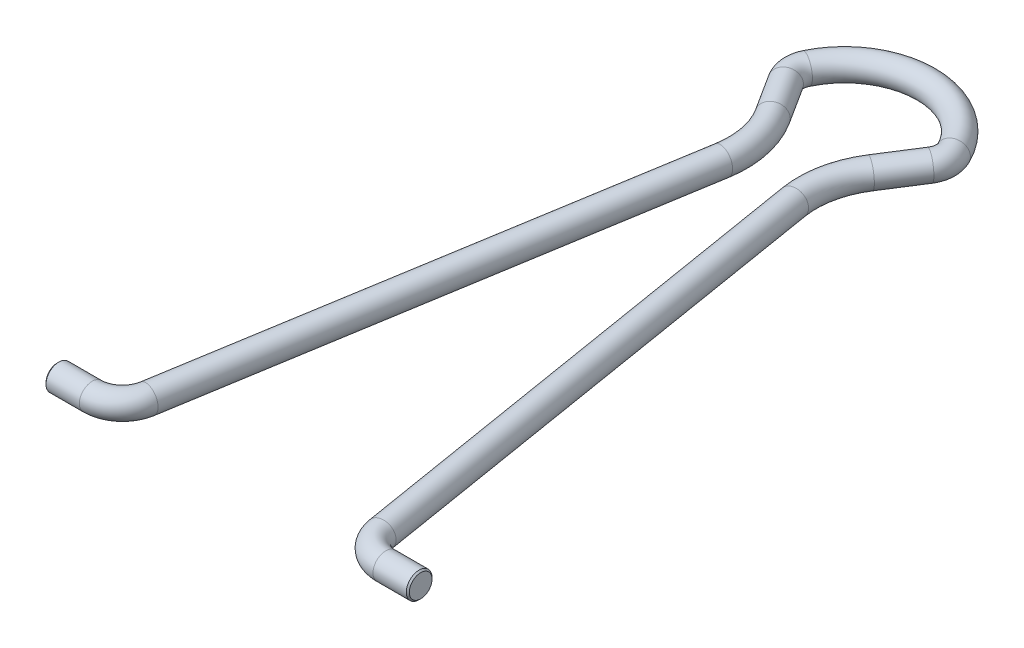
ISO-10303-21;
HEADER;
FILE_DESCRIPTION(('STEP AP214'),'2;1');
FILE_NAME('part.step','',(''),(''),'','','');
FILE_SCHEMA(('AUTOMOTIVE_DESIGN { 1 0 10303 214 1 1 1 1 }'));
ENDSEC;
DATA;
#1=APPLICATION_CONTEXT('core data for automotive mechanical design processes');
#2=APPLICATION_PROTOCOL_DEFINITION('international standard','automotive_design',2000,#1);
#3=PRODUCT_CONTEXT('',#1,'mechanical');
#4=PRODUCT('Part','Part','',(#3));
#5=PRODUCT_RELATED_PRODUCT_CATEGORY('part','',(#4));
#6=PRODUCT_DEFINITION_FORMATION('','',#4);
#7=PRODUCT_DEFINITION_CONTEXT('part definition',#1,'design');
#8=PRODUCT_DEFINITION('design','',#6,#7);
#9=PRODUCT_DEFINITION_SHAPE('','',#8);
#10=(LENGTH_UNIT() NAMED_UNIT(*) SI_UNIT(.MILLI.,.METRE.));
#11=(NAMED_UNIT(*) PLANE_ANGLE_UNIT() SI_UNIT($,.RADIAN.));
#12=(NAMED_UNIT(*) SI_UNIT($,.STERADIAN.) SOLID_ANGLE_UNIT());
#13=UNCERTAINTY_MEASURE_WITH_UNIT(LENGTH_MEASURE(1.E-05),#10,'distance_accuracy_value','');
#14=(GEOMETRIC_REPRESENTATION_CONTEXT(3) GLOBAL_UNCERTAINTY_ASSIGNED_CONTEXT((#13)) GLOBAL_UNIT_ASSIGNED_CONTEXT((#10,
#11,#12)) REPRESENTATION_CONTEXT('',''));
#15=CARTESIAN_POINT('',(0.,0.,0.));
#16=DIRECTION('',(0.,0.,1.));
#17=DIRECTION('',(1.,0.,0.));
#18=AXIS2_PLACEMENT_3D('',#15,#16,#17);
#19=CARTESIAN_POINT('',(9.6983875282643,0.,40.));
#20=DIRECTION('',(1.,0.,0.));
#21=DIRECTION('',(0.,0.,-1.));
#22=AXIS2_PLACEMENT_3D('',#19,#20,#21);
#23=CYLINDRICAL_SURFACE('',#22,0.85);
#24=CARTESIAN_POINT('',(11.9,0.,40.));
#25=DIRECTION('',(-1.,0.,0.));
#26=DIRECTION('',(0.,0.,1.));
#27=AXIS2_PLACEMENT_3D('',#24,#25,#26);
#28=CIRCLE('',#27,0.85);
#29=CARTESIAN_POINT('',(11.9,0.,40.85));
#30=VERTEX_POINT('',#29);
#31=EDGE_CURVE('E40',#30,#30,#28,.T.);
#32=ORIENTED_EDGE('',*,*,#31,.T.);
#33=EDGE_LOOP('',(#32));
#34=FACE_BOUND('',#33,.T.);
#35=CARTESIAN_POINT('',(9.6983875282643,0.,40.));
#36=DIRECTION('',(-1.,0.,0.));
#37=DIRECTION('',(0.,0.,1.));
#38=AXIS2_PLACEMENT_3D('',#35,#36,#37);
#39=CIRCLE('',#38,0.85);
#40=CARTESIAN_POINT('',(9.69838752826431,0.,40.85));
#41=VERTEX_POINT('',#40);
#42=EDGE_CURVE('E53',#41,#41,#39,.T.);
#43=ORIENTED_EDGE('',*,*,#42,.F.);
#44=EDGE_LOOP('',(#43));
#45=FACE_BOUND('',#44,.T.);
#46=ADVANCED_FACE('F33',(#34,#45),#23,.T.);
#47=CARTESIAN_POINT('',(9.6983875282643,0.,38.));
#48=DIRECTION('',(0.,1.,0.));
#49=DIRECTION('',(0.,0.,1.));
#50=AXIS2_PLACEMENT_3D('',#47,#48,#49);
#51=TOROIDAL_SURFACE('',#50,2.00000000000001,0.85);
#52=CARTESIAN_POINT('',(7.7248149569055,0.,38.3240544793399));
#53=DIRECTION('',(-0.162027239669911,0.,-0.986786285679401));
#54=DIRECTION('',(-0.986786285679401,0.,0.162027239669911));
#55=AXIS2_PLACEMENT_3D('',#52,#53,#54);
#56=CIRCLE('',#55,0.85);
#57=CARTESIAN_POINT('',(6.88604661407801,0.,38.4617776330593));
#58=VERTEX_POINT('',#57);
#59=EDGE_CURVE('E56',#58,#58,#56,.T.);
#60=CARTESIAN_POINT('',(9.6983875282643,0.,38.));
#61=DIRECTION('',(0.,1.,0.));
#62=DIRECTION('',(0.,0.,1.));
#63=AXIS2_PLACEMENT_3D('',#60,#61,#62);
#64=CIRCLE('',#63,2.85000000000001);
#65=EDGE_CURVE('',#58,#41,#64,.T.);
#66=ORIENTED_EDGE('',*,*,#59,.F.);
#67=ORIENTED_EDGE('',*,*,#42,.T.);
#68=ORIENTED_EDGE('',*,*,#65,.T.);
#69=ORIENTED_EDGE('',*,*,#65,.F.);
#70=EDGE_LOOP('',(#66,#68,#67,#69));
#71=FACE_BOUND('',#70,.T.);
#72=ADVANCED_FACE('F149',(#71),#51,.T.);
#73=CARTESIAN_POINT('',(2.37168582438217,0.,5.72216343801957));
#74=DIRECTION('',(0.162027239669928,0.,0.986786285679399));
#75=DIRECTION('',(0.986786285679399,0.,-0.162027239669928));
#76=AXIS2_PLACEMENT_3D('',#73,#74,#75);
#77=CYLINDRICAL_SURFACE('',#76,0.85);
#78=CARTESIAN_POINT('',(2.37168582438217,0.,5.72216343801957));
#79=DIRECTION('',(-0.162027239669911,0.,-0.986786285679401));
#80=DIRECTION('',(-0.986786285679401,0.,0.162027239669911));
#81=AXIS2_PLACEMENT_3D('',#78,#79,#80);
#82=CIRCLE('',#81,0.85);
#83=CARTESIAN_POINT('',(1.53291748155468,0.,5.859886591739));
#84=VERTEX_POINT('',#83);
#85=EDGE_CURVE('E59',#84,#84,#82,.T.);
#86=ORIENTED_EDGE('',*,*,#85,.F.);
#87=EDGE_LOOP('',(#86));
#88=FACE_BOUND('',#87,.T.);
#89=ORIENTED_EDGE('',*,*,#59,.T.);
#90=EDGE_LOOP('',(#89));
#91=FACE_BOUND('',#90,.T.);
#92=ADVANCED_FACE('F143',(#88,#91),#77,.T.);
#93=CARTESIAN_POINT('',(8.29240353845856,0.,4.75));
#94=DIRECTION('',(0.,1.,0.));
#95=DIRECTION('',(0.,0.,1.));
#96=AXIS2_PLACEMENT_3D('',#93,#94,#95);
#97=TOROIDAL_SURFACE('',#96,6.,0.85);
#98=CARTESIAN_POINT('',(3.23329193146445,0.,1.52426136396988));
#99=DIRECTION('',(0.537623106005034,0.,-0.843185267832343));
#100=DIRECTION('',(-0.843185267832343,0.,-0.537623106005034));
#101=AXIS2_PLACEMENT_3D('',#98,#99,#100);
#102=CIRCLE('',#101,0.85);
#103=CARTESIAN_POINT('',(2.51658445380695,0.,1.06728172386561));
#104=VERTEX_POINT('',#103);
#105=EDGE_CURVE('E62',#104,#104,#102,.T.);
#106=CARTESIAN_POINT('',(8.29240353845856,0.,4.75));
#107=DIRECTION('',(0.,1.,0.));
#108=DIRECTION('',(0.,0.,1.));
#109=AXIS2_PLACEMENT_3D('',#106,#107,#108);
#110=CIRCLE('',#109,6.85);
#111=EDGE_CURVE('',#104,#84,#110,.T.);
#112=ORIENTED_EDGE('',*,*,#105,.F.);
#113=ORIENTED_EDGE('',*,*,#85,.T.);
#114=ORIENTED_EDGE('',*,*,#111,.T.);
#115=ORIENTED_EDGE('',*,*,#111,.F.);
#116=EDGE_LOOP('',(#112,#114,#113,#115));
#117=FACE_BOUND('',#116,.T.);
#118=ADVANCED_FACE('F137',(#117),#97,.T.);
#119=CARTESIAN_POINT('',(4.76477790174853,0.,-0.877656250083367));
#120=DIRECTION('',(-0.537623106005019,0.,0.843185267832352));
#121=DIRECTION('',(0.843185267832352,0.,0.537623106005019));
#122=AXIS2_PLACEMENT_3D('',#119,#120,#121);
#123=CYLINDRICAL_SURFACE('',#122,0.85);
#124=CARTESIAN_POINT('',(4.76477790174853,0.,-0.877656250083367));
#125=DIRECTION('',(0.537623106005034,0.,-0.843185267832343));
#126=DIRECTION('',(-0.843185267832343,0.,-0.537623106005034));
#127=AXIS2_PLACEMENT_3D('',#124,#125,#126);
#128=CIRCLE('',#127,0.85);
#129=CARTESIAN_POINT('',(5.48148537940602,0.,-0.420676609979096));
#130=VERTEX_POINT('',#129);
#131=EDGE_CURVE('E65',#130,#130,#128,.T.);
#132=ORIENTED_EDGE('',*,*,#131,.F.);
#133=EDGE_LOOP('',(#132));
#134=FACE_BOUND('',#133,.T.);
#135=ORIENTED_EDGE('',*,*,#105,.T.);
#136=EDGE_LOOP('',(#135));
#137=FACE_BOUND('',#136,.T.);
#138=ADVANCED_FACE('F131',(#134,#137),#123,.T.);
#139=CARTESIAN_POINT('',(3.5,0.,-1.68409090909091));
#140=DIRECTION('',(0.,-1.,0.));
#141=DIRECTION('',(0.,0.,-1.));
#142=AXIS2_PLACEMENT_3D('',#139,#140,#141);
#143=TOROIDAL_SURFACE('',#142,1.5,0.85);
#144=CARTESIAN_POINT('',(4.85166764189585,0.,-2.33447124847066));
#145=DIRECTION('',(-0.433586892919828,0.,-0.901111761263901));
#146=DIRECTION('',(-0.901111761263901,0.,0.433586892919828));
#147=AXIS2_PLACEMENT_3D('',#144,#145,#146);
#148=CIRCLE('',#147,0.85);
#149=CARTESIAN_POINT('',(5.61761263897016,0.,-2.70302010745253));
#150=VERTEX_POINT('',#149);
#151=EDGE_CURVE('E68',#150,#150,#148,.T.);
#152=CARTESIAN_POINT('',(3.5,0.,-1.68409090909091));
#153=DIRECTION('',(0.,-1.,0.));
#154=DIRECTION('',(0.,0.,-1.));
#155=AXIS2_PLACEMENT_3D('',#152,#153,#154);
#156=CIRCLE('',#155,2.35);
#157=EDGE_CURVE('',#150,#130,#156,.T.);
#158=ORIENTED_EDGE('',*,*,#151,.F.);
#159=ORIENTED_EDGE('',*,*,#131,.T.);
#160=ORIENTED_EDGE('',*,*,#157,.T.);
#161=ORIENTED_EDGE('',*,*,#157,.F.);
#162=EDGE_LOOP('',(#158,#160,#159,#161));
#163=FACE_BOUND('',#162,.T.);
#164=ADVANCED_FACE('F125',(#163),#143,.T.);
#165=CARTESIAN_POINT('',(0.,0.,0.));
#166=DIRECTION('',(0.,-1.,0.));
#167=DIRECTION('',(0.,0.,-1.));
#168=AXIS2_PLACEMENT_3D('',#165,#166,#167);
#169=TOROIDAL_SURFACE('',#168,5.38409090909091,0.85);
#170=CARTESIAN_POINT('',(-4.85166764189585,0.,-2.33447124847066));
#171=DIRECTION('',(-0.433586892919844,0.,0.901111761263893));
#172=DIRECTION('',(0.901111761263893,0.,0.433586892919844));
#173=AXIS2_PLACEMENT_3D('',#170,#171,#172);
#174=CIRCLE('',#173,0.85);
#175=CARTESIAN_POINT('',(-5.61761263897016,0.,-2.70302010745252));
#176=VERTEX_POINT('',#175);
#177=EDGE_CURVE('E71',#176,#176,#174,.T.);
#178=CARTESIAN_POINT('',(0.,0.,0.));
#179=DIRECTION('',(0.,-1.,0.));
#180=DIRECTION('',(0.,0.,-1.));
#181=AXIS2_PLACEMENT_3D('',#178,#179,#180);
#182=CIRCLE('',#181,6.23409090909091);
#183=EDGE_CURVE('',#176,#150,#182,.T.);
#184=ORIENTED_EDGE('',*,*,#177,.F.);
#185=ORIENTED_EDGE('',*,*,#151,.T.);
#186=ORIENTED_EDGE('',*,*,#183,.T.);
#187=ORIENTED_EDGE('',*,*,#183,.F.);
#188=EDGE_LOOP('',(#184,#186,#185,#187));
#189=FACE_BOUND('',#188,.T.);
#190=ADVANCED_FACE('F119',(#189),#169,.T.);
#191=CARTESIAN_POINT('',(-3.5,0.,-1.68409090909091));
#192=DIRECTION('',(0.,-1.,0.));
#193=DIRECTION('',(0.,0.,-1.));
#194=AXIS2_PLACEMENT_3D('',#191,#192,#193);
#195=TOROIDAL_SURFACE('',#194,1.5,0.85);
#196=CARTESIAN_POINT('',(-4.76477790174852,0.,-0.877656250083364));
#197=DIRECTION('',(0.537623106005019,0.,0.843185267832352));
#198=DIRECTION('',(0.843185267832352,0.,-0.537623106005019));
#199=AXIS2_PLACEMENT_3D('',#196,#197,#198);
#200=CIRCLE('',#199,0.85);
#201=CARTESIAN_POINT('',(-5.48148537940602,0.,-0.420676609979091));
#202=VERTEX_POINT('',#201);
#203=EDGE_CURVE('E74',#202,#202,#200,.T.);
#204=CARTESIAN_POINT('',(-3.5,0.,-1.68409090909091));
#205=DIRECTION('',(0.,-1.,0.));
#206=DIRECTION('',(0.,0.,-1.));
#207=AXIS2_PLACEMENT_3D('',#204,#205,#206);
#208=CIRCLE('',#207,2.35);
#209=EDGE_CURVE('',#202,#176,#208,.T.);
#210=ORIENTED_EDGE('',*,*,#203,.F.);
#211=ORIENTED_EDGE('',*,*,#177,.T.);
#212=ORIENTED_EDGE('',*,*,#209,.T.);
#213=ORIENTED_EDGE('',*,*,#209,.F.);
#214=EDGE_LOOP('',(#210,#212,#211,#213));
#215=FACE_BOUND('',#214,.T.);
#216=ADVANCED_FACE('F113',(#215),#195,.T.);
#217=CARTESIAN_POINT('',(-3.23329193146445,0.,1.52426136396989));
#218=DIRECTION('',(-0.537623106005018,0.,-0.843185267832353));
#219=DIRECTION('',(-0.843185267832353,0.,0.537623106005018));
#220=AXIS2_PLACEMENT_3D('',#217,#218,#219);
#221=CYLINDRICAL_SURFACE('',#220,0.85);
#222=CARTESIAN_POINT('',(-3.23329193146445,0.,1.52426136396989));
#223=DIRECTION('',(0.537623106005019,0.,0.843185267832352));
#224=DIRECTION('',(0.843185267832352,0.,-0.537623106005019));
#225=AXIS2_PLACEMENT_3D('',#222,#223,#224);
#226=CIRCLE('',#225,0.85);
#227=CARTESIAN_POINT('',(-2.51658445380695,0.,1.06728172386562));
#228=VERTEX_POINT('',#227);
#229=EDGE_CURVE('E77',#228,#228,#226,.T.);
#230=ORIENTED_EDGE('',*,*,#229,.F.);
#231=EDGE_LOOP('',(#230));
#232=FACE_BOUND('',#231,.T.);
#233=ORIENTED_EDGE('',*,*,#203,.T.);
#234=EDGE_LOOP('',(#233));
#235=FACE_BOUND('',#234,.T.);
#236=ADVANCED_FACE('F107',(#232,#235),#221,.T.);
#237=CARTESIAN_POINT('',(-8.29240353845856,0.,4.75));
#238=DIRECTION('',(0.,1.,0.));
#239=DIRECTION('',(0.,0.,1.));
#240=AXIS2_PLACEMENT_3D('',#237,#238,#239);
#241=TOROIDAL_SURFACE('',#240,6.,0.85);
#242=CARTESIAN_POINT('',(-2.37168582438217,0.,5.72216343801957));
#243=DIRECTION('',(-0.162027239669928,0.,0.986786285679399));
#244=DIRECTION('',(0.986786285679399,0.,0.162027239669928));
#245=AXIS2_PLACEMENT_3D('',#242,#243,#244);
#246=CIRCLE('',#245,0.85);
#247=CARTESIAN_POINT('',(-1.53291748155468,0.,5.85988659173901));
#248=VERTEX_POINT('',#247);
#249=EDGE_CURVE('E80',#248,#248,#246,.T.);
#250=CARTESIAN_POINT('',(-8.29240353845856,0.,4.75));
#251=DIRECTION('',(0.,1.,0.));
#252=DIRECTION('',(0.,0.,1.));
#253=AXIS2_PLACEMENT_3D('',#250,#251,#252);
#254=CIRCLE('',#253,6.85);
#255=EDGE_CURVE('',#248,#228,#254,.T.);
#256=ORIENTED_EDGE('',*,*,#249,.F.);
#257=ORIENTED_EDGE('',*,*,#229,.T.);
#258=ORIENTED_EDGE('',*,*,#255,.T.);
#259=ORIENTED_EDGE('',*,*,#255,.F.);
#260=EDGE_LOOP('',(#256,#258,#257,#259));
#261=FACE_BOUND('',#260,.T.);
#262=ADVANCED_FACE('F101',(#261),#241,.T.);
#263=CARTESIAN_POINT('',(-7.7248149569055,0.,38.3240544793399));
#264=DIRECTION('',(0.162027239669928,0.,-0.986786285679399));
#265=DIRECTION('',(-0.986786285679399,0.,-0.162027239669928));
#266=AXIS2_PLACEMENT_3D('',#263,#264,#265);
#267=CYLINDRICAL_SURFACE('',#266,0.85);
#268=CARTESIAN_POINT('',(-7.7248149569055,0.,38.3240544793399));
#269=DIRECTION('',(-0.162027239669928,0.,0.986786285679399));
#270=DIRECTION('',(0.986786285679399,0.,0.162027239669928));
#271=AXIS2_PLACEMENT_3D('',#268,#269,#270);
#272=CIRCLE('',#271,0.85);
#273=CARTESIAN_POINT('',(-6.88604661407801,0.,38.4617776330593));
#274=VERTEX_POINT('',#273);
#275=EDGE_CURVE('E83',#274,#274,#272,.T.);
#276=ORIENTED_EDGE('',*,*,#275,.F.);
#277=EDGE_LOOP('',(#276));
#278=FACE_BOUND('',#277,.T.);
#279=ORIENTED_EDGE('',*,*,#249,.T.);
#280=EDGE_LOOP('',(#279));
#281=FACE_BOUND('',#280,.T.);
#282=ADVANCED_FACE('F95',(#278,#281),#267,.T.);
#283=CARTESIAN_POINT('',(-9.6983875282643,0.,38.));
#284=DIRECTION('',(0.,1.,0.));
#285=DIRECTION('',(0.,0.,1.));
#286=AXIS2_PLACEMENT_3D('',#283,#284,#285);
#287=TOROIDAL_SURFACE('',#286,2.,0.85);
#288=CARTESIAN_POINT('',(-9.6983875282643,0.,40.));
#289=DIRECTION('',(-1.,0.,0.));
#290=DIRECTION('',(0.,0.,1.));
#291=AXIS2_PLACEMENT_3D('',#288,#289,#290);
#292=CIRCLE('',#291,0.85);
#293=CARTESIAN_POINT('',(-9.6983875282643,0.,40.85));
#294=VERTEX_POINT('',#293);
#295=EDGE_CURVE('E86',#294,#294,#292,.T.);
#296=CARTESIAN_POINT('',(-9.6983875282643,0.,38.));
#297=DIRECTION('',(0.,1.,0.));
#298=DIRECTION('',(0.,0.,1.));
#299=AXIS2_PLACEMENT_3D('',#296,#297,#298);
#300=CIRCLE('',#299,2.85);
#301=EDGE_CURVE('',#294,#274,#300,.T.);
#302=ORIENTED_EDGE('',*,*,#295,.F.);
#303=ORIENTED_EDGE('',*,*,#275,.T.);
#304=ORIENTED_EDGE('',*,*,#301,.T.);
#305=ORIENTED_EDGE('',*,*,#301,.F.);
#306=EDGE_LOOP('',(#302,#304,#303,#305));
#307=FACE_BOUND('',#306,.T.);
#308=ADVANCED_FACE('F92',(#307),#287,.T.);
#309=CARTESIAN_POINT('',(-9.6983875282643,0.,40.));
#310=DIRECTION('',(-1.,0.,0.));
#311=DIRECTION('',(0.,0.,1.));
#312=AXIS2_PLACEMENT_3D('',#309,#310,#311);
#313=CYLINDRICAL_SURFACE('',#312,0.85);
#314=CARTESIAN_POINT('',(-11.9,0.,40.));
#315=DIRECTION('',(-1.,0.,0.));
#316=DIRECTION('',(0.,0.,1.));
#317=AXIS2_PLACEMENT_3D('',#314,#315,#316);
#318=CIRCLE('',#317,0.85);
#319=CARTESIAN_POINT('',(-11.9,0.,40.85));
#320=VERTEX_POINT('',#319);
#321=EDGE_CURVE('E44',#320,#320,#318,.F.);
#322=ORIENTED_EDGE('',*,*,#321,.T.);
#323=EDGE_LOOP('',(#322));
#324=FACE_BOUND('',#323,.T.);
#325=ORIENTED_EDGE('',*,*,#295,.T.);
#326=EDGE_LOOP('',(#325));
#327=FACE_BOUND('',#326,.T.);
#328=ADVANCED_FACE('F90',(#324,#327),#313,.T.);
#329=CARTESIAN_POINT('',(12.,0.,40.));
#330=DIRECTION('',(-1.,0.,0.));
#331=DIRECTION('',(0.,0.,1.));
#332=AXIS2_PLACEMENT_3D('',#329,#330,#331);
#333=PLANE('',#332);
#334=CARTESIAN_POINT('',(12.,0.,40.));
#335=DIRECTION('',(-1.,0.,0.));
#336=DIRECTION('',(0.,0.,1.));
#337=AXIS2_PLACEMENT_3D('',#334,#335,#336);
#338=CIRCLE('',#337,0.750000000000022);
#339=CARTESIAN_POINT('',(12.,0.,40.75));
#340=VERTEX_POINT('',#339);
#341=EDGE_CURVE('E10',#340,#340,#338,.F.);
#342=ORIENTED_EDGE('',*,*,#341,.T.);
#343=EDGE_LOOP('',(#342));
#344=FACE_BOUND('',#343,.T.);
#345=ADVANCED_FACE('F171',(#344),#333,.F.);
#346=CARTESIAN_POINT('',(-12.,0.,40.));
#347=DIRECTION('',(-1.,0.,0.));
#348=DIRECTION('',(0.,0.,1.));
#349=AXIS2_PLACEMENT_3D('',#346,#347,#348);
#350=PLANE('',#349);
#351=CARTESIAN_POINT('',(-12.,0.,40.));
#352=DIRECTION('',(-1.,0.,0.));
#353=DIRECTION('',(0.,0.,1.));
#354=AXIS2_PLACEMENT_3D('',#351,#352,#353);
#355=CIRCLE('',#354,0.750000000000001);
#356=CARTESIAN_POINT('',(-12.,0.,40.75));
#357=VERTEX_POINT('',#356);
#358=EDGE_CURVE('E48',#357,#357,#355,.T.);
#359=ORIENTED_EDGE('',*,*,#358,.T.);
#360=EDGE_LOOP('',(#359));
#361=FACE_BOUND('',#360,.T.);
#362=ADVANCED_FACE('F164',(#361),#350,.T.);
#363=CARTESIAN_POINT('',(-12.,0.,40.));
#364=DIRECTION('',(1.,0.,0.));
#365=DIRECTION('',(0.,0.,-1.));
#366=AXIS2_PLACEMENT_3D('',#363,#364,#365);
#367=CONICAL_SURFACE('',#366,0.750000000000001,0.785398163397464);
#368=ORIENTED_EDGE('',*,*,#321,.F.);
#369=EDGE_LOOP('',(#368));
#370=FACE_BOUND('',#369,.T.);
#371=ORIENTED_EDGE('',*,*,#358,.F.);
#372=EDGE_LOOP('',(#371));
#373=FACE_BOUND('',#372,.T.);
#374=ADVANCED_FACE('F162',(#370,#373),#367,.T.);
#375=CARTESIAN_POINT('',(11.9,0.,40.));
#376=DIRECTION('',(-1.,0.,0.));
#377=DIRECTION('',(0.,0.,1.));
#378=AXIS2_PLACEMENT_3D('',#375,#376,#377);
#379=CONICAL_SURFACE('',#378,0.85,0.785398163397473);
#380=ORIENTED_EDGE('',*,*,#341,.F.);
#381=EDGE_LOOP('',(#380));
#382=FACE_BOUND('',#381,.T.);
#383=ORIENTED_EDGE('',*,*,#31,.F.);
#384=EDGE_LOOP('',(#383));
#385=FACE_BOUND('',#384,.T.);
#386=ADVANCED_FACE('F35',(#382,#385),#379,.T.);
#387=CLOSED_SHELL('',(#46,#72,#92,#118,#138,#164,#190,#216,#236,#262,#282,#308,#328,#345,#362,
#374,#386));
#388=MANIFOLD_SOLID_BREP('B2',#387);
#389=ADVANCED_BREP_SHAPE_REPRESENTATION('',(#18,#388),#14);
#390=SHAPE_DEFINITION_REPRESENTATION(#9,#389);
ENDSEC;
END-ISO-10303-21;
